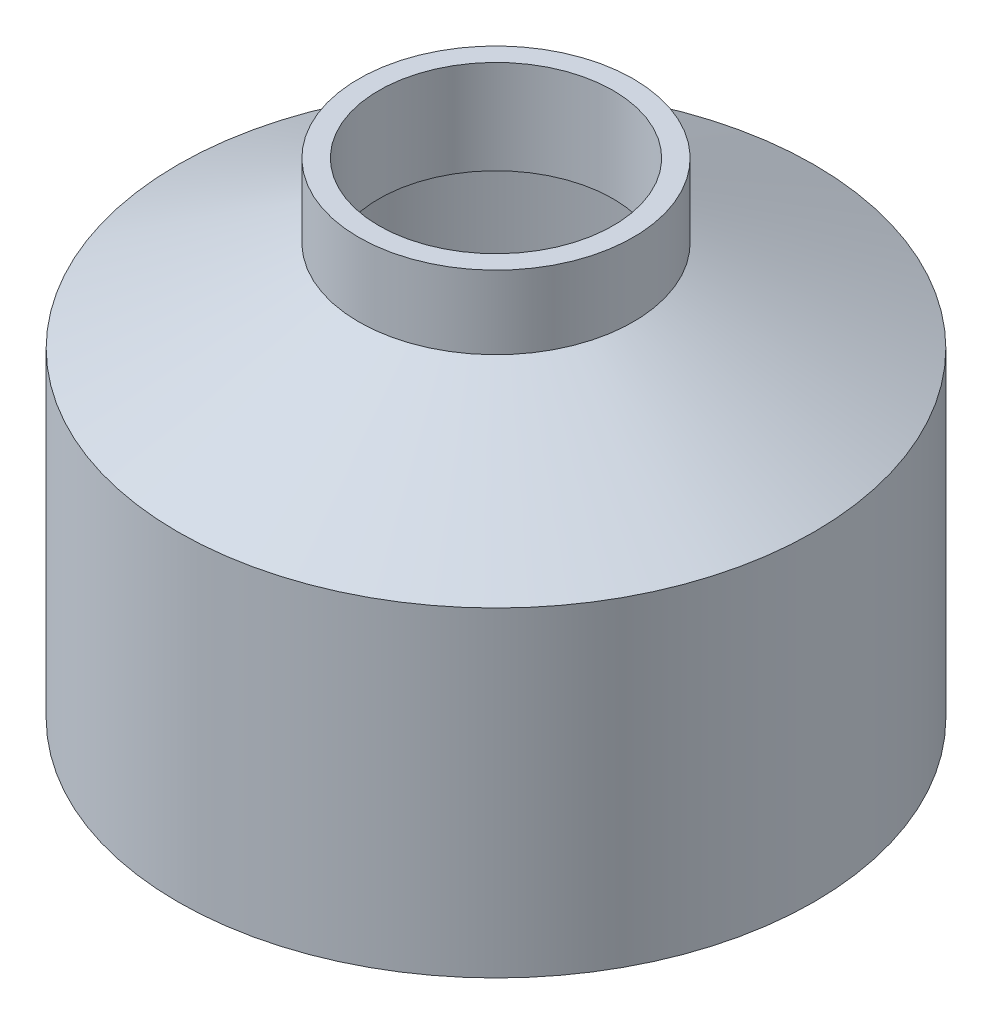
ISO-10303-21;
HEADER;
FILE_DESCRIPTION(('STEP AP214'),'2;1');
FILE_NAME('part.step','',(''),(''),'','','');
FILE_SCHEMA(('AUTOMOTIVE_DESIGN { 1 0 10303 214 1 1 1 1 }'));
ENDSEC;
DATA;
#1=APPLICATION_CONTEXT('core data for automotive mechanical design processes');
#2=APPLICATION_PROTOCOL_DEFINITION('international standard','automotive_design',2000,#1);
#3=PRODUCT_CONTEXT('',#1,'mechanical');
#4=PRODUCT('Part','Part','',(#3));
#5=PRODUCT_RELATED_PRODUCT_CATEGORY('part','',(#4));
#6=PRODUCT_DEFINITION_FORMATION('','',#4);
#7=PRODUCT_DEFINITION_CONTEXT('part definition',#1,'design');
#8=PRODUCT_DEFINITION('design','',#6,#7);
#9=PRODUCT_DEFINITION_SHAPE('','',#8);
#10=(LENGTH_UNIT() NAMED_UNIT(*) SI_UNIT(.MILLI.,.METRE.));
#11=(NAMED_UNIT(*) PLANE_ANGLE_UNIT() SI_UNIT($,.RADIAN.));
#12=(NAMED_UNIT(*) SI_UNIT($,.STERADIAN.) SOLID_ANGLE_UNIT());
#13=UNCERTAINTY_MEASURE_WITH_UNIT(LENGTH_MEASURE(1.E-05),#10,'distance_accuracy_value','');
#14=(GEOMETRIC_REPRESENTATION_CONTEXT(3) GLOBAL_UNCERTAINTY_ASSIGNED_CONTEXT((#13)) GLOBAL_UNIT_ASSIGNED_CONTEXT((#10,
#11,#12)) REPRESENTATION_CONTEXT('',''));
#15=CARTESIAN_POINT('',(0.,0.,0.));
#16=DIRECTION('',(0.,0.,1.));
#17=DIRECTION('',(1.,0.,0.));
#18=AXIS2_PLACEMENT_3D('',#15,#16,#17);
#19=CARTESIAN_POINT('',(0.,35.,0.));
#20=DIRECTION('',(0.,-1.,0.));
#21=DIRECTION('',(0.,0.,-1.));
#22=AXIS2_PLACEMENT_3D('',#19,#20,#21);
#23=CYLINDRICAL_SURFACE('',#22,34.75);
#24=CARTESIAN_POINT('',(0.,35.,0.));
#25=DIRECTION('',(0.,-1.,0.));
#26=DIRECTION('',(0.,0.,-1.));
#27=AXIS2_PLACEMENT_3D('',#24,#25,#26);
#28=CIRCLE('',#27,34.75);
#29=CARTESIAN_POINT('',(0.,35.,-34.75));
#30=VERTEX_POINT('',#29);
#31=EDGE_CURVE('E11',#30,#30,#28,.F.);
#32=ORIENTED_EDGE('',*,*,#31,.F.);
#33=EDGE_LOOP('',(#32));
#34=FACE_BOUND('',#33,.T.);
#35=CARTESIAN_POINT('',(0.,0.,0.));
#36=DIRECTION('',(0.,1.,0.));
#37=DIRECTION('',(0.,0.,1.));
#38=AXIS2_PLACEMENT_3D('',#35,#36,#37);
#39=CIRCLE('',#38,34.75);
#40=CARTESIAN_POINT('',(0.,0.,34.75));
#41=VERTEX_POINT('',#40);
#42=EDGE_CURVE('E47',#41,#41,#39,.T.);
#43=ORIENTED_EDGE('',*,*,#42,.T.);
#44=EDGE_LOOP('',(#43));
#45=FACE_BOUND('',#44,.T.);
#46=ADVANCED_FACE('F39',(#34,#45),#23,.T.);
#47=CARTESIAN_POINT('',(0.,0.,0.));
#48=DIRECTION('',(0.,1.,0.));
#49=DIRECTION('',(0.,0.,1.));
#50=AXIS2_PLACEMENT_3D('',#47,#48,#49);
#51=PLANE('',#50);
#52=CARTESIAN_POINT('',(0.,0.,0.));
#53=DIRECTION('',(0.,1.,0.));
#54=DIRECTION('',(0.,0.,1.));
#55=AXIS2_PLACEMENT_3D('',#52,#53,#54);
#56=CIRCLE('',#55,31.75);
#57=CARTESIAN_POINT('',(0.,0.,31.75));
#58=VERTEX_POINT('',#57);
#59=EDGE_CURVE('E100',#58,#58,#56,.T.);
#60=ORIENTED_EDGE('',*,*,#59,.T.);
#61=EDGE_LOOP('',(#60));
#62=FACE_BOUND('',#61,.T.);
#63=ORIENTED_EDGE('',*,*,#42,.F.);
#64=EDGE_LOOP('',(#63));
#65=FACE_BOUND('',#64,.T.);
#66=ADVANCED_FACE('F82',(#62,#65),#51,.F.);
#67=CARTESIAN_POINT('',(0.,45.,0.));
#68=DIRECTION('',(0.,-1.,0.));
#69=DIRECTION('',(0.,0.,-1.));
#70=AXIS2_PLACEMENT_3D('',#67,#68,#69);
#71=CONICAL_SURFACE('',#70,15.,1.10209825568502);
#72=ORIENTED_EDGE('',*,*,#31,.T.);
#73=EDGE_LOOP('',(#72));
#74=FACE_BOUND('',#73,.T.);
#75=CARTESIAN_POINT('',(0.,45.,0.));
#76=DIRECTION('',(0.,1.,0.));
#77=DIRECTION('',(0.,0.,1.));
#78=AXIS2_PLACEMENT_3D('',#75,#76,#77);
#79=CIRCLE('',#78,15.);
#80=CARTESIAN_POINT('',(0.,45.,15.));
#81=VERTEX_POINT('',#80);
#82=EDGE_CURVE('E53',#81,#81,#79,.T.);
#83=ORIENTED_EDGE('',*,*,#82,.F.);
#84=EDGE_LOOP('',(#83));
#85=FACE_BOUND('',#84,.T.);
#86=ADVANCED_FACE('F77',(#74,#85),#71,.T.);
#87=CARTESIAN_POINT('',(0.,53.,0.));
#88=DIRECTION('',(0.,-1.,0.));
#89=DIRECTION('',(0.,0.,-1.));
#90=AXIS2_PLACEMENT_3D('',#87,#88,#89);
#91=CYLINDRICAL_SURFACE('',#90,15.);
#92=CARTESIAN_POINT('',(0.,53.,0.));
#93=DIRECTION('',(0.,1.,0.));
#94=DIRECTION('',(0.,0.,1.));
#95=AXIS2_PLACEMENT_3D('',#92,#93,#94);
#96=CIRCLE('',#95,15.);
#97=CARTESIAN_POINT('',(0.,53.,15.));
#98=VERTEX_POINT('',#97);
#99=EDGE_CURVE('E95',#98,#98,#96,.T.);
#100=ORIENTED_EDGE('',*,*,#99,.F.);
#101=EDGE_LOOP('',(#100));
#102=FACE_BOUND('',#101,.T.);
#103=ORIENTED_EDGE('',*,*,#82,.T.);
#104=EDGE_LOOP('',(#103));
#105=FACE_BOUND('',#104,.T.);
#106=ADVANCED_FACE('F66',(#102,#105),#91,.T.);
#107=CARTESIAN_POINT('',(0.,53.,0.));
#108=DIRECTION('',(0.,1.,0.));
#109=DIRECTION('',(0.,0.,1.));
#110=AXIS2_PLACEMENT_3D('',#107,#108,#109);
#111=PLANE('',#110);
#112=CARTESIAN_POINT('',(0.,53.,0.));
#113=DIRECTION('',(0.,1.,0.));
#114=DIRECTION('',(0.,0.,1.));
#115=AXIS2_PLACEMENT_3D('',#112,#113,#114);
#116=CIRCLE('',#115,12.8);
#117=CARTESIAN_POINT('',(0.,53.,12.8));
#118=VERTEX_POINT('',#117);
#119=EDGE_CURVE('E104',#118,#118,#116,.T.);
#120=ORIENTED_EDGE('',*,*,#119,.F.);
#121=EDGE_LOOP('',(#120));
#122=FACE_BOUND('',#121,.T.);
#123=ORIENTED_EDGE('',*,*,#99,.T.);
#124=EDGE_LOOP('',(#123));
#125=FACE_BOUND('',#124,.T.);
#126=ADVANCED_FACE('F76',(#122,#125),#111,.T.);
#127=CARTESIAN_POINT('',(0.,35.,0.));
#128=DIRECTION('',(0.,-1.,0.));
#129=DIRECTION('',(0.,0.,-1.));
#130=AXIS2_PLACEMENT_3D('',#127,#128,#129);
#131=CYLINDRICAL_SURFACE('',#130,31.75);
#132=CARTESIAN_POINT('',(0.,33.1563510925677,0.));
#133=DIRECTION('',(0.,-1.,0.));
#134=DIRECTION('',(0.,0.,-1.));
#135=AXIS2_PLACEMENT_3D('',#132,#133,#134);
#136=CIRCLE('',#135,31.75);
#137=CARTESIAN_POINT('',(0.,33.1563510925677,-31.75));
#138=VERTEX_POINT('',#137);
#139=EDGE_CURVE('E99',#138,#138,#136,.F.);
#140=ORIENTED_EDGE('',*,*,#139,.T.);
#141=EDGE_LOOP('',(#140));
#142=FACE_BOUND('',#141,.T.);
#143=ORIENTED_EDGE('',*,*,#59,.F.);
#144=EDGE_LOOP('',(#143));
#145=FACE_BOUND('',#144,.T.);
#146=ADVANCED_FACE('F125',(#142,#145),#131,.F.);
#147=CARTESIAN_POINT('',(0.,42.3235285255343,0.));
#148=DIRECTION('',(0.,-1.,0.));
#149=DIRECTION('',(0.,0.,-1.));
#150=AXIS2_PLACEMENT_3D('',#147,#148,#149);
#151=CONICAL_SURFACE('',#150,13.6448245698908,1.10209825568502);
#152=CARTESIAN_POINT('',(0.,42.7512878014284,0.));
#153=DIRECTION('',(0.,-1.,0.));
#154=DIRECTION('',(0.,0.,-1.));
#155=AXIS2_PLACEMENT_3D('',#152,#153,#154);
#156=CIRCLE('',#155,12.8);
#157=CARTESIAN_POINT('',(0.,42.7512878014284,-12.8));
#158=VERTEX_POINT('',#157);
#159=EDGE_CURVE('E42',#158,#158,#156,.F.);
#160=ORIENTED_EDGE('',*,*,#159,.T.);
#161=EDGE_LOOP('',(#160));
#162=FACE_BOUND('',#161,.T.);
#163=ORIENTED_EDGE('',*,*,#139,.F.);
#164=EDGE_LOOP('',(#163));
#165=FACE_BOUND('',#164,.T.);
#166=ADVANCED_FACE('F116',(#162,#165),#151,.F.);
#167=CARTESIAN_POINT('',(0.,0.,0.));
#168=DIRECTION('',(0.,1.,0.));
#169=DIRECTION('',(0.,0.,1.));
#170=AXIS2_PLACEMENT_3D('',#167,#168,#169);
#171=CYLINDRICAL_SURFACE('',#170,12.8);
#172=ORIENTED_EDGE('',*,*,#119,.T.);
#173=EDGE_LOOP('',(#172));
#174=FACE_BOUND('',#173,.T.);
#175=ORIENTED_EDGE('',*,*,#159,.F.);
#176=EDGE_LOOP('',(#175));
#177=FACE_BOUND('',#176,.T.);
#178=ADVANCED_FACE('F119',(#174,#177),#171,.F.);
#179=CLOSED_SHELL('',(#46,#66,#86,#106,#126,#146,#166,#178));
#180=MANIFOLD_SOLID_BREP('B2',#179);
#181=ADVANCED_BREP_SHAPE_REPRESENTATION('',(#18,#180),#14);
#182=SHAPE_DEFINITION_REPRESENTATION(#9,#181);
ENDSEC;
END-ISO-10303-21;
